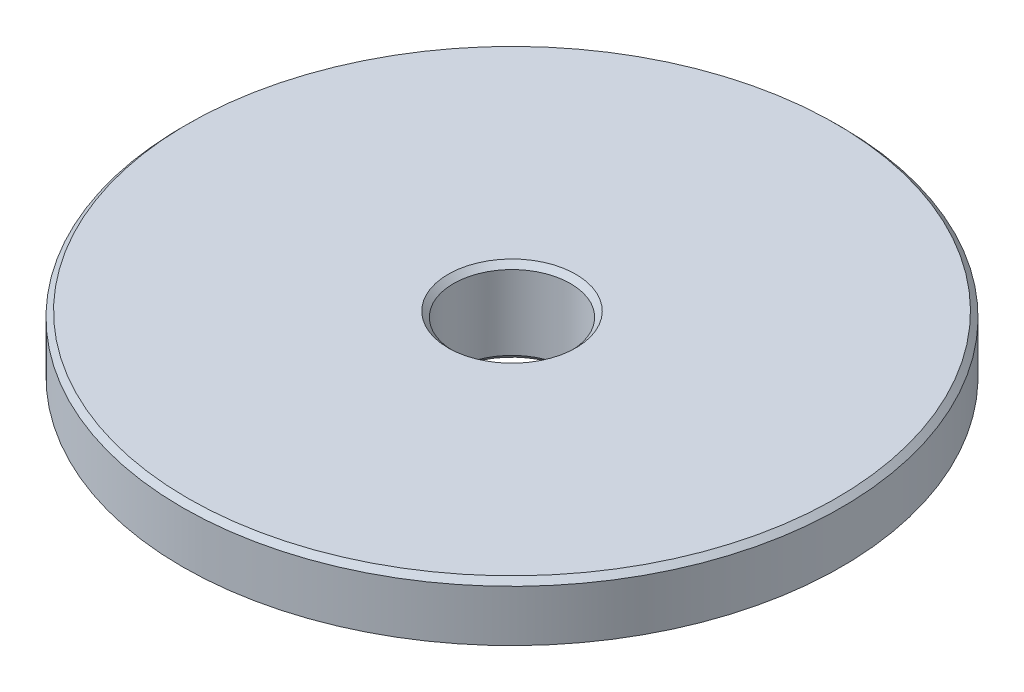
ISO-10303-21;
HEADER;
FILE_DESCRIPTION(('STEP AP214'),'2;1');
FILE_NAME('part.step','',(''),(''),'','','');
FILE_SCHEMA(('AUTOMOTIVE_DESIGN { 1 0 10303 214 1 1 1 1 }'));
ENDSEC;
DATA;
#1=APPLICATION_CONTEXT('core data for automotive mechanical design processes');
#2=APPLICATION_PROTOCOL_DEFINITION('international standard','automotive_design',2000,#1);
#3=PRODUCT_CONTEXT('',#1,'mechanical');
#4=PRODUCT('Part','Part','',(#3));
#5=PRODUCT_RELATED_PRODUCT_CATEGORY('part','',(#4));
#6=PRODUCT_DEFINITION_FORMATION('','',#4);
#7=PRODUCT_DEFINITION_CONTEXT('part definition',#1,'design');
#8=PRODUCT_DEFINITION('design','',#6,#7);
#9=PRODUCT_DEFINITION_SHAPE('','',#8);
#10=(LENGTH_UNIT() NAMED_UNIT(*) SI_UNIT(.MILLI.,.METRE.));
#11=(NAMED_UNIT(*) PLANE_ANGLE_UNIT() SI_UNIT($,.RADIAN.));
#12=(NAMED_UNIT(*) SI_UNIT($,.STERADIAN.) SOLID_ANGLE_UNIT());
#13=UNCERTAINTY_MEASURE_WITH_UNIT(LENGTH_MEASURE(1.E-05),#10,'distance_accuracy_value','');
#14=(GEOMETRIC_REPRESENTATION_CONTEXT(3) GLOBAL_UNCERTAINTY_ASSIGNED_CONTEXT((#13)) GLOBAL_UNIT_ASSIGNED_CONTEXT((#10,
#11,#12)) REPRESENTATION_CONTEXT('',''));
#15=CARTESIAN_POINT('',(0.,0.,0.));
#16=DIRECTION('',(0.,0.,1.));
#17=DIRECTION('',(1.,0.,0.));
#18=AXIS2_PLACEMENT_3D('',#15,#16,#17);
#19=CARTESIAN_POINT('',(15.08125,0.,0.));
#20=DIRECTION('',(0.,-1.,0.));
#21=DIRECTION('',(0.,0.,-1.));
#22=AXIS2_PLACEMENT_3D('',#19,#20,#21);
#23=PLANE('',#22);
#24=CARTESIAN_POINT('',(0.,0.,0.));
#25=DIRECTION('',(0.,-1.,0.));
#26=DIRECTION('',(0.,0.,-1.));
#27=AXIS2_PLACEMENT_3D('',#24,#25,#26);
#28=CIRCLE('',#27,3.57500000000002);
#29=CARTESIAN_POINT('',(0.,0.,-3.57500000000002));
#30=VERTEX_POINT('',#29);
#31=EDGE_CURVE('E42',#30,#30,#28,.F.);
#32=ORIENTED_EDGE('',*,*,#31,.T.);
#33=EDGE_LOOP('',(#32));
#34=FACE_BOUND('',#33,.T.);
#35=CARTESIAN_POINT('',(0.,0.,0.));
#36=DIRECTION('',(0.,-1.,0.));
#37=DIRECTION('',(0.,0.,-1.));
#38=AXIS2_PLACEMENT_3D('',#35,#36,#37);
#39=CIRCLE('',#38,14.78125);
#40=CARTESIAN_POINT('',(0.,0.,-14.78125));
#41=VERTEX_POINT('',#40);
#42=EDGE_CURVE('E46',#41,#41,#39,.T.);
#43=ORIENTED_EDGE('',*,*,#42,.T.);
#44=EDGE_LOOP('',(#43));
#45=FACE_BOUND('',#44,.T.);
#46=ADVANCED_FACE('F31',(#34,#45),#23,.T.);
#47=CARTESIAN_POINT('',(0.,0.,0.));
#48=DIRECTION('',(0.,-1.,0.));
#49=DIRECTION('',(0.,0.,-1.));
#50=AXIS2_PLACEMENT_3D('',#47,#48,#49);
#51=CYLINDRICAL_SURFACE('',#50,15.08125);
#52=CARTESIAN_POINT('',(0.,0.300000000000024,0.));
#53=DIRECTION('',(0.,-1.,0.));
#54=DIRECTION('',(0.,0.,-1.));
#55=AXIS2_PLACEMENT_3D('',#52,#53,#54);
#56=CIRCLE('',#55,15.08125);
#57=CARTESIAN_POINT('',(0.,0.300000000000024,-15.08125));
#58=VERTEX_POINT('',#57);
#59=EDGE_CURVE('E38',#58,#58,#56,.F.);
#60=ORIENTED_EDGE('',*,*,#59,.T.);
#61=EDGE_LOOP('',(#60));
#62=FACE_BOUND('',#61,.T.);
#63=CARTESIAN_POINT('',(0.,1.3890625,0.));
#64=DIRECTION('',(0.,-1.,0.));
#65=DIRECTION('',(0.,0.,-1.));
#66=AXIS2_PLACEMENT_3D('',#63,#64,#65);
#67=CIRCLE('',#66,15.08125);
#68=CARTESIAN_POINT('',(0.,1.3890625,-15.08125));
#69=VERTEX_POINT('',#68);
#70=EDGE_CURVE('E63',#69,#69,#67,.T.);
#71=ORIENTED_EDGE('',*,*,#70,.T.);
#72=EDGE_LOOP('',(#71));
#73=FACE_BOUND('',#72,.T.);
#74=ADVANCED_FACE('F90',(#62,#73),#51,.T.);
#75=CARTESIAN_POINT('',(0.,1.5875,0.));
#76=DIRECTION('',(0.,-1.,0.));
#77=DIRECTION('',(0.,0.,-1.));
#78=AXIS2_PLACEMENT_3D('',#75,#76,#77);
#79=TOROIDAL_SURFACE('',#78,15.08125,0.1984375);
#80=CARTESIAN_POINT('',(0.,1.5875,0.));
#81=DIRECTION('',(0.,-1.,0.));
#82=DIRECTION('',(0.,0.,-1.));
#83=AXIS2_PLACEMENT_3D('',#80,#81,#82);
#84=CIRCLE('',#83,15.2796875);
#85=CARTESIAN_POINT('',(0.,1.5875,-15.2796875));
#86=VERTEX_POINT('',#85);
#87=EDGE_CURVE('E66',#86,#86,#84,.T.);
#88=ORIENTED_EDGE('',*,*,#87,.T.);
#89=EDGE_LOOP('',(#88));
#90=FACE_BOUND('',#89,.T.);
#91=ORIENTED_EDGE('',*,*,#70,.F.);
#92=EDGE_LOOP('',(#91));
#93=FACE_BOUND('',#92,.T.);
#94=ADVANCED_FACE('F87',(#90,#93),#79,.F.);
#95=CARTESIAN_POINT('',(18.4546875,1.5875,0.));
#96=DIRECTION('',(0.,-1.,0.));
#97=DIRECTION('',(0.,0.,-1.));
#98=AXIS2_PLACEMENT_3D('',#95,#96,#97);
#99=PLANE('',#98);
#100=CARTESIAN_POINT('',(0.,1.5875,0.));
#101=DIRECTION('',(0.,-1.,0.));
#102=DIRECTION('',(0.,0.,-1.));
#103=AXIS2_PLACEMENT_3D('',#100,#101,#102);
#104=CIRCLE('',#103,18.4546875);
#105=CARTESIAN_POINT('',(0.,1.5875,-18.4546875));
#106=VERTEX_POINT('',#105);
#107=EDGE_CURVE('E69',#106,#106,#104,.T.);
#108=ORIENTED_EDGE('',*,*,#107,.T.);
#109=EDGE_LOOP('',(#108));
#110=FACE_BOUND('',#109,.T.);
#111=ORIENTED_EDGE('',*,*,#87,.F.);
#112=EDGE_LOOP('',(#111));
#113=FACE_BOUND('',#112,.T.);
#114=ADVANCED_FACE('F73',(#110,#113),#99,.T.);
#115=CARTESIAN_POINT('',(0.,0.,0.));
#116=DIRECTION('',(0.,-1.,0.));
#117=DIRECTION('',(0.,0.,-1.));
#118=AXIS2_PLACEMENT_3D('',#115,#116,#117);
#119=CYLINDRICAL_SURFACE('',#118,18.4546875);
#120=CARTESIAN_POINT('',(0.,4.4625,0.));
#121=DIRECTION('',(0.,1.,0.));
#122=DIRECTION('',(0.,0.,1.));
#123=AXIS2_PLACEMENT_3D('',#120,#121,#122);
#124=CIRCLE('',#123,18.4546875);
#125=CARTESIAN_POINT('',(0.,4.4625,18.4546875));
#126=VERTEX_POINT('',#125);
#127=EDGE_CURVE('E10',#126,#126,#124,.F.);
#128=ORIENTED_EDGE('',*,*,#127,.T.);
#129=EDGE_LOOP('',(#128));
#130=FACE_BOUND('',#129,.T.);
#131=ORIENTED_EDGE('',*,*,#107,.F.);
#132=EDGE_LOOP('',(#131));
#133=FACE_BOUND('',#132,.T.);
#134=ADVANCED_FACE('F76',(#130,#133),#119,.T.);
#135=CARTESIAN_POINT('',(0.,4.7625,0.));
#136=DIRECTION('',(0.,1.,0.));
#137=DIRECTION('',(0.,0.,1.));
#138=AXIS2_PLACEMENT_3D('',#135,#136,#137);
#139=PLANE('',#138);
#140=CARTESIAN_POINT('',(0.,4.7625,0.));
#141=DIRECTION('',(0.,1.,0.));
#142=DIRECTION('',(0.,0.,1.));
#143=AXIS2_PLACEMENT_3D('',#140,#141,#142);
#144=CIRCLE('',#143,3.57499999999998);
#145=CARTESIAN_POINT('',(0.,4.7625,3.57499999999998));
#146=VERTEX_POINT('',#145);
#147=EDGE_CURVE('E57',#146,#146,#144,.F.);
#148=ORIENTED_EDGE('',*,*,#147,.T.);
#149=EDGE_LOOP('',(#148));
#150=FACE_BOUND('',#149,.T.);
#151=CARTESIAN_POINT('',(0.,4.7625,0.));
#152=DIRECTION('',(0.,1.,0.));
#153=DIRECTION('',(0.,0.,1.));
#154=AXIS2_PLACEMENT_3D('',#151,#152,#153);
#155=CIRCLE('',#154,18.1546875);
#156=CARTESIAN_POINT('',(0.,4.7625,18.1546875));
#157=VERTEX_POINT('',#156);
#158=EDGE_CURVE('E60',#157,#157,#155,.T.);
#159=ORIENTED_EDGE('',*,*,#158,.T.);
#160=EDGE_LOOP('',(#159));
#161=FACE_BOUND('',#160,.T.);
#162=ADVANCED_FACE('F78',(#150,#161),#139,.T.);
#163=CARTESIAN_POINT('',(0.,4.7625,0.));
#164=DIRECTION('',(0.,-1.,0.));
#165=DIRECTION('',(0.,0.,-1.));
#166=AXIS2_PLACEMENT_3D('',#163,#164,#165);
#167=CYLINDRICAL_SURFACE('',#166,3.275);
#168=CARTESIAN_POINT('',(0.,4.46250000000003,0.));
#169=DIRECTION('',(0.,1.,0.));
#170=DIRECTION('',(0.,0.,1.));
#171=AXIS2_PLACEMENT_3D('',#168,#169,#170);
#172=CIRCLE('',#171,3.275);
#173=CARTESIAN_POINT('',(0.,4.46250000000003,-3.275));
#174=VERTEX_POINT('',#173);
#175=EDGE_CURVE('E51',#174,#174,#172,.T.);
#176=CARTESIAN_POINT('',(0.,0.300000000000013,0.));
#177=DIRECTION('',(0.,-1.,0.));
#178=DIRECTION('',(0.,0.,-1.));
#179=AXIS2_PLACEMENT_3D('',#176,#177,#178);
#180=CIRCLE('',#179,3.275);
#181=CARTESIAN_POINT('',(0.,0.300000000000014,-3.275));
#182=VERTEX_POINT('',#181);
#183=EDGE_CURVE('E54',#182,#182,#180,.T.);
#184=CARTESIAN_POINT('',(0.,4.46250000000003,-3.275));
#185=CARTESIAN_POINT('',(0.,4.41914062500003,-3.275));
#186=CARTESIAN_POINT('',(0.,4.37578125000003,-3.275));
#187=CARTESIAN_POINT('',(0.,4.28906250000003,-3.275));
#188=CARTESIAN_POINT('',(0.,4.24570312500003,-3.275));
#189=CARTESIAN_POINT('',(0.,4.15898437500003,-3.275));
#190=CARTESIAN_POINT('',(0.,4.11562500000003,-3.275));
#191=CARTESIAN_POINT('',(0.,4.02890625000003,-3.275));
#192=CARTESIAN_POINT('',(0.,3.98554687500003,-3.275));
#193=CARTESIAN_POINT('',(0.,3.89882812500002,-3.275));
#194=CARTESIAN_POINT('',(0.,3.85546875000003,-3.275));
#195=CARTESIAN_POINT('',(0.,3.76875000000002,-3.275));
#196=CARTESIAN_POINT('',(0.,3.72539062500002,-3.275));
#197=CARTESIAN_POINT('',(0.,3.63867187500002,-3.275));
#198=CARTESIAN_POINT('',(0.,3.59531250000002,-3.275));
#199=CARTESIAN_POINT('',(0.,3.50859375000002,-3.275));
#200=CARTESIAN_POINT('',(0.,3.46523437500002,-3.275));
#201=CARTESIAN_POINT('',(0.,3.37851562500002,-3.275));
#202=CARTESIAN_POINT('',(0.,3.33515625000002,-3.275));
#203=CARTESIAN_POINT('',(0.,3.24843750000002,-3.275));
#204=CARTESIAN_POINT('',(0.,3.20507812500002,-3.275));
#205=CARTESIAN_POINT('',(0.,3.11835937500002,-3.275));
#206=CARTESIAN_POINT('',(0.,3.07500000000002,-3.275));
#207=CARTESIAN_POINT('',(0.,2.98828125000002,-3.275));
#208=CARTESIAN_POINT('',(0.,2.94492187500002,-3.275));
#209=CARTESIAN_POINT('',(0.,2.85820312500002,-3.275));
#210=CARTESIAN_POINT('',(0.,2.81484375000002,-3.275));
#211=CARTESIAN_POINT('',(0.,2.72812500000002,-3.275));
#212=CARTESIAN_POINT('',(0.,2.68476562500002,-3.275));
#213=CARTESIAN_POINT('',(0.,2.59804687500002,-3.275));
#214=CARTESIAN_POINT('',(0.,2.55468750000002,-3.275));
#215=CARTESIAN_POINT('',(0.,2.46796875000002,-3.275));
#216=CARTESIAN_POINT('',(0.,2.42460937500002,-3.275));
#217=CARTESIAN_POINT('',(0.,2.33789062500002,-3.275));
#218=CARTESIAN_POINT('',(0.,2.29453125000002,-3.275));
#219=CARTESIAN_POINT('',(0.,2.20781250000002,-3.275));
#220=CARTESIAN_POINT('',(0.,2.16445312500002,-3.275));
#221=CARTESIAN_POINT('',(0.,2.07773437500002,-3.275));
#222=CARTESIAN_POINT('',(0.,2.03437500000002,-3.275));
#223=CARTESIAN_POINT('',(0.,1.94765625000002,-3.275));
#224=CARTESIAN_POINT('',(0.,1.90429687500002,-3.275));
#225=CARTESIAN_POINT('',(0.,1.81757812500002,-3.275));
#226=CARTESIAN_POINT('',(0.,1.77421875000002,-3.275));
#227=CARTESIAN_POINT('',(0.,1.68750000000002,-3.275));
#228=CARTESIAN_POINT('',(0.,1.64414062500002,-3.275));
#229=CARTESIAN_POINT('',(0.,1.55742187500002,-3.275));
#230=CARTESIAN_POINT('',(0.,1.51406250000002,-3.275));
#231=CARTESIAN_POINT('',(0.,1.42734375000002,-3.275));
#232=CARTESIAN_POINT('',(0.,1.38398437500002,-3.275));
#233=CARTESIAN_POINT('',(0.,1.29726562500002,-3.275));
#234=CARTESIAN_POINT('',(0.,1.25390625000002,-3.275));
#235=CARTESIAN_POINT('',(0.,1.16718750000002,-3.275));
#236=CARTESIAN_POINT('',(0.,1.12382812500002,-3.275));
#237=CARTESIAN_POINT('',(0.,1.03710937500002,-3.275));
#238=CARTESIAN_POINT('',(0.,0.993750000000016,-3.275));
#239=CARTESIAN_POINT('',(0.,0.907031250000016,-3.275));
#240=CARTESIAN_POINT('',(0.,0.863671875000016,-3.275));
#241=CARTESIAN_POINT('',(0.,0.776953125000015,-3.275));
#242=CARTESIAN_POINT('',(0.,0.733593750000015,-3.275));
#243=CARTESIAN_POINT('',(0.,0.646875000000015,-3.275));
#244=CARTESIAN_POINT('',(0.,0.603515625000015,-3.275));
#245=CARTESIAN_POINT('',(0.,0.516796875000014,-3.275));
#246=CARTESIAN_POINT('',(0.,0.473437500000014,-3.275));
#247=CARTESIAN_POINT('',(0.,0.386718750000014,-3.275));
#248=CARTESIAN_POINT('',(0.,0.343359375000014,-3.275));
#249=CARTESIAN_POINT('',(0.,0.300000000000014,-3.275));
#250=B_SPLINE_CURVE_WITH_KNOTS('',3,(#184,#185,#186,#187,#188,#189,#190,#191,#192,#193,#194,
#195,#196,#197,#198,#199,#200,#201,#202,#203,#204,#205,#206,#207,#208,#209,#210,#211,#212,#213,
#214,#215,#216,#217,#218,#219,#220,#221,#222,#223,#224,#225,#226,#227,#228,#229,#230,#231,#232,
#233,#234,#235,#236,#237,#238,#239,#240,#241,#242,#243,#244,#245,#246,#247,#248,#249),
.UNSPECIFIED.,.F.,.F.,(4,2,2,2,2,2,2,2,2,2,2,2,2,2,2,2,2,2,2,2,2,2,2,2,2,2,2,2,2,2,2,2,4),(0.,
0.130078125,0.26015625,0.390234375,0.520312500000001,0.650390625000002,0.780468750000002,
0.910546875000002,1.040625,1.170703125,1.30078125,1.430859375,1.5609375,1.691015625,
1.82109375000001,1.95117187500001,2.08125000000001,2.21132812500001,2.34140625000001,
2.47148437500001,2.60156250000001,2.73164062500001,2.86171875000001,2.99179687500001,
3.12187500000001,3.25195312500001,3.38203125000001,3.51210937500001,3.64218750000001,
3.77226562500001,3.90234375000001,4.03242187500001,4.16250000000001),.UNSPECIFIED.);
#251=EDGE_CURVE('BSEAM84',#174,#182,#250,.T.);
#252=ORIENTED_EDGE('',*,*,#175,.T.);
#253=ORIENTED_EDGE('',*,*,#183,.T.);
#254=ORIENTED_EDGE('',*,*,#251,.T.);
#255=ORIENTED_EDGE('',*,*,#251,.F.);
#256=EDGE_LOOP('',(#252,#254,#253,#255));
#257=FACE_BOUND('',#256,.T.);
#258=ADVANCED_FACE('F84',(#257),#167,.F.);
#259=CARTESIAN_POINT('',(0.,4.7625,0.));
#260=DIRECTION('',(0.,1.,0.));
#261=DIRECTION('',(0.,0.,1.));
#262=AXIS2_PLACEMENT_3D('',#259,#260,#261);
#263=CONICAL_SURFACE('',#262,3.57499999999998,0.785398163397462);
#264=ORIENTED_EDGE('',*,*,#175,.F.);
#265=EDGE_LOOP('',(#264));
#266=FACE_BOUND('',#265,.T.);
#267=ORIENTED_EDGE('',*,*,#147,.F.);
#268=EDGE_LOOP('',(#267));
#269=FACE_BOUND('',#268,.T.);
#270=ADVANCED_FACE('F100',(#266,#269),#263,.F.);
#271=CARTESIAN_POINT('',(0.,0.300000000000013,0.));
#272=DIRECTION('',(0.,-1.,0.));
#273=DIRECTION('',(0.,0.,-1.));
#274=AXIS2_PLACEMENT_3D('',#271,#272,#273);
#275=CONICAL_SURFACE('',#274,3.275,0.785398163397463);
#276=ORIENTED_EDGE('',*,*,#31,.F.);
#277=EDGE_LOOP('',(#276));
#278=FACE_BOUND('',#277,.T.);
#279=ORIENTED_EDGE('',*,*,#183,.F.);
#280=EDGE_LOOP('',(#279));
#281=FACE_BOUND('',#280,.T.);
#282=ADVANCED_FACE('F103',(#278,#281),#275,.F.);
#283=CARTESIAN_POINT('',(0.,0.,0.));
#284=DIRECTION('',(0.,1.,0.));
#285=DIRECTION('',(0.,0.,1.));
#286=AXIS2_PLACEMENT_3D('',#283,#284,#285);
#287=CONICAL_SURFACE('',#286,14.78125,0.78539816339744);
#288=ORIENTED_EDGE('',*,*,#59,.F.);
#289=EDGE_LOOP('',(#288));
#290=FACE_BOUND('',#289,.T.);
#291=ORIENTED_EDGE('',*,*,#42,.F.);
#292=EDGE_LOOP('',(#291));
#293=FACE_BOUND('',#292,.T.);
#294=ADVANCED_FACE('F106',(#290,#293),#287,.T.);
#295=CARTESIAN_POINT('',(0.,4.4625,0.));
#296=DIRECTION('',(0.,-1.,0.));
#297=DIRECTION('',(0.,0.,-1.));
#298=AXIS2_PLACEMENT_3D('',#295,#296,#297);
#299=CONICAL_SURFACE('',#298,18.4546875,0.785398163397448);
#300=ORIENTED_EDGE('',*,*,#158,.F.);
#301=EDGE_LOOP('',(#300));
#302=FACE_BOUND('',#301,.T.);
#303=ORIENTED_EDGE('',*,*,#127,.F.);
#304=EDGE_LOOP('',(#303));
#305=FACE_BOUND('',#304,.T.);
#306=ADVANCED_FACE('F33',(#302,#305),#299,.T.);
#307=CLOSED_SHELL('',(#46,#74,#94,#114,#134,#162,#258,#270,#282,#294,#306));
#308=MANIFOLD_SOLID_BREP('B2',#307);
#309=ADVANCED_BREP_SHAPE_REPRESENTATION('',(#18,#308),#14);
#310=SHAPE_DEFINITION_REPRESENTATION(#9,#309);
ENDSEC;
END-ISO-10303-21;
